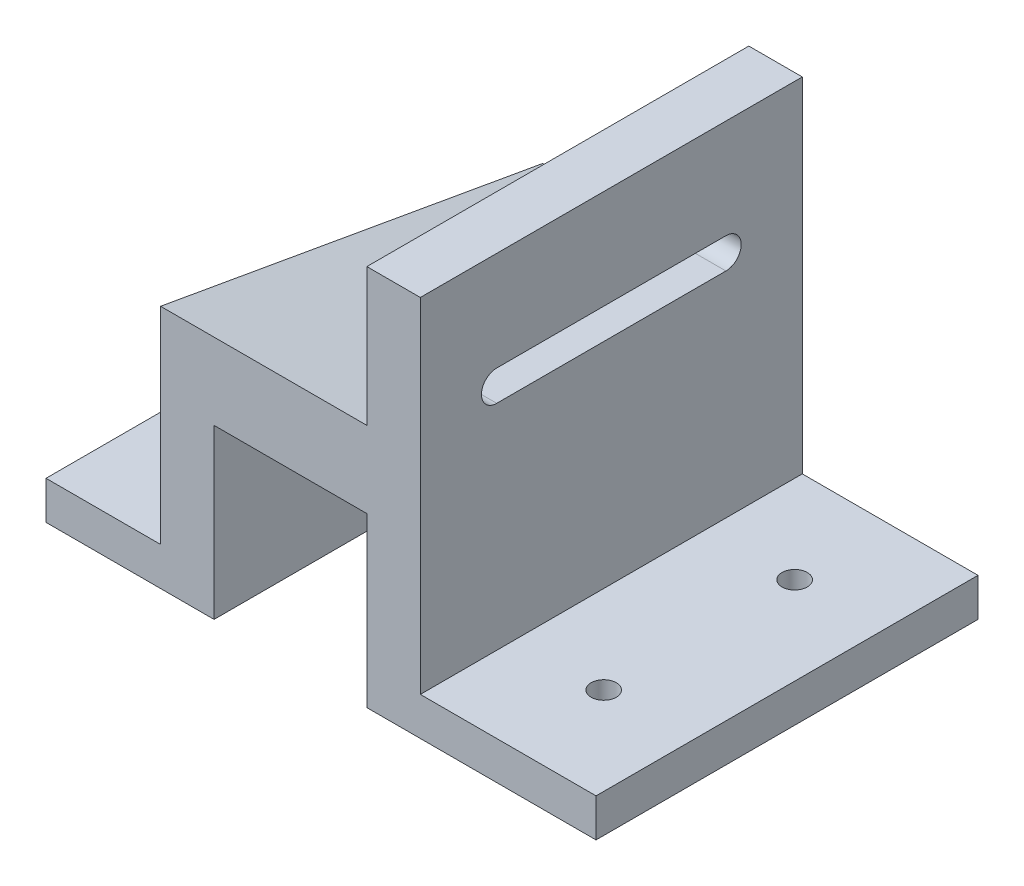
ISO-10303-21;
HEADER;
FILE_DESCRIPTION(('STEP AP214'),'2;1');
FILE_NAME('part.step','',(''),(''),'','','');
FILE_SCHEMA(('AUTOMOTIVE_DESIGN { 1 0 10303 214 1 1 1 1 }'));
ENDSEC;
DATA;
#1=APPLICATION_CONTEXT('core data for automotive mechanical design processes');
#2=APPLICATION_PROTOCOL_DEFINITION('international standard','automotive_design',2000,#1);
#3=PRODUCT_CONTEXT('',#1,'mechanical');
#4=PRODUCT('Part','Part','',(#3));
#5=PRODUCT_RELATED_PRODUCT_CATEGORY('part','',(#4));
#6=PRODUCT_DEFINITION_FORMATION('','',#4);
#7=PRODUCT_DEFINITION_CONTEXT('part definition',#1,'design');
#8=PRODUCT_DEFINITION('design','',#6,#7);
#9=PRODUCT_DEFINITION_SHAPE('','',#8);
#10=(LENGTH_UNIT() NAMED_UNIT(*) SI_UNIT(.MILLI.,.METRE.));
#11=(NAMED_UNIT(*) PLANE_ANGLE_UNIT() SI_UNIT($,.RADIAN.));
#12=(NAMED_UNIT(*) SI_UNIT($,.STERADIAN.) SOLID_ANGLE_UNIT());
#13=UNCERTAINTY_MEASURE_WITH_UNIT(LENGTH_MEASURE(1.E-05),#10,'distance_accuracy_value','');
#14=(GEOMETRIC_REPRESENTATION_CONTEXT(3) GLOBAL_UNCERTAINTY_ASSIGNED_CONTEXT((#13)) GLOBAL_UNIT_ASSIGNED_CONTEXT((#10,
#11,#12)) REPRESENTATION_CONTEXT('',''));
#15=CARTESIAN_POINT('',(0.,0.,0.));
#16=DIRECTION('',(0.,0.,1.));
#17=DIRECTION('',(1.,0.,0.));
#18=AXIS2_PLACEMENT_3D('',#15,#16,#17);
#19=CARTESIAN_POINT('',(0.,7.,50.));
#20=DIRECTION('',(1.,0.,0.));
#21=DIRECTION('',(0.,0.,-1.));
#22=AXIS2_PLACEMENT_3D('',#19,#20,#21);
#23=PLANE('',#22);
#24=DIRECTION('',(0.,-1.,0.));
#25=VECTOR('',#24,1.);
#26=CARTESIAN_POINT('',(0.,7.,50.));
#27=LINE('',#26,#25);
#28=CARTESIAN_POINT('',(0.,22.,50.));
#29=VERTEX_POINT('',#28);
#30=CARTESIAN_POINT('',(0.,0.,50.));
#31=VERTEX_POINT('',#30);
#32=EDGE_CURVE('E160',#29,#31,#27,.T.);
#33=ORIENTED_EDGE('',*,*,#32,.F.);
#34=DIRECTION('',(0.,0.173648177666935,0.984807753012207));
#35=VECTOR('',#34,1.);
#36=CARTESIAN_POINT('',(0.,12.201530393167,-5.56988254130722));
#37=LINE('',#36,#35);
#38=CARTESIAN_POINT('',(0.,13.1836509645765,0.));
#39=VERTEX_POINT('',#38);
#40=EDGE_CURVE('E162',#39,#29,#37,.T.);
#41=ORIENTED_EDGE('',*,*,#40,.F.);
#42=DIRECTION('',(0.,-1.,0.));
#43=VECTOR('',#42,1.);
#44=CARTESIAN_POINT('',(0.,7.,0.));
#45=LINE('',#44,#43);
#46=CARTESIAN_POINT('',(0.,0.,0.));
#47=VERTEX_POINT('',#46);
#48=EDGE_CURVE('E46',#39,#47,#45,.T.);
#49=ORIENTED_EDGE('',*,*,#48,.T.);
#50=DIRECTION('',(0.,0.,-1.));
#51=VECTOR('',#50,1.);
#52=CARTESIAN_POINT('',(0.,0.,50.));
#53=LINE('',#52,#51);
#54=EDGE_CURVE('E164',#31,#47,#53,.T.);
#55=ORIENTED_EDGE('',*,*,#54,.F.);
#56=EDGE_LOOP('',(#33,#41,#49,#55));
#57=FACE_BOUND('',#56,.T.);
#58=ADVANCED_FACE('F33',(#57),#23,.F.);
#59=CARTESIAN_POINT('',(0.,0.,50.));
#60=DIRECTION('',(0.,1.,0.));
#61=DIRECTION('',(0.,0.,1.));
#62=AXIS2_PLACEMENT_3D('',#59,#60,#61);
#63=PLANE('',#62);
#64=CARTESIAN_POINT('',(18.5,0.,12.5));
#65=DIRECTION('',(0.,1.,0.));
#66=DIRECTION('',(0.,0.,1.));
#67=AXIS2_PLACEMENT_3D('',#64,#65,#66);
#68=CIRCLE('',#67,1.65);
#69=CARTESIAN_POINT('',(18.5,0.,14.15));
#70=VERTEX_POINT('',#69);
#71=EDGE_CURVE('E203',#70,#70,#68,.T.);
#72=ORIENTED_EDGE('',*,*,#71,.T.);
#73=EDGE_LOOP('',(#72));
#74=FACE_BOUND('',#73,.T.);
#75=CARTESIAN_POINT('',(18.5,0.,37.5));
#76=DIRECTION('',(0.,1.,0.));
#77=DIRECTION('',(0.,0.,1.));
#78=AXIS2_PLACEMENT_3D('',#75,#76,#77);
#79=CIRCLE('',#78,1.65);
#80=CARTESIAN_POINT('',(18.5,0.,39.15));
#81=VERTEX_POINT('',#80);
#82=EDGE_CURVE('E210',#81,#81,#79,.T.);
#83=ORIENTED_EDGE('',*,*,#82,.T.);
#84=EDGE_LOOP('',(#83));
#85=FACE_BOUND('',#84,.T.);
#86=DIRECTION('',(1.,0.,0.));
#87=VECTOR('',#86,1.);
#88=CARTESIAN_POINT('',(0.,0.,0.));
#89=LINE('',#88,#87);
#90=CARTESIAN_POINT('',(30.,0.,0.));
#91=VERTEX_POINT('',#90);
#92=EDGE_CURVE('E258',#47,#91,#89,.T.);
#93=ORIENTED_EDGE('',*,*,#92,.T.);
#94=DIRECTION('',(0.,0.,-1.));
#95=VECTOR('',#94,1.);
#96=CARTESIAN_POINT('',(30.,0.,50.));
#97=LINE('',#96,#95);
#98=CARTESIAN_POINT('',(30.,0.,50.));
#99=VERTEX_POINT('',#98);
#100=EDGE_CURVE('E300',#99,#91,#97,.T.);
#101=ORIENTED_EDGE('',*,*,#100,.F.);
#102=DIRECTION('',(1.,0.,0.));
#103=VECTOR('',#102,1.);
#104=CARTESIAN_POINT('',(0.,0.,50.));
#105=LINE('',#104,#103);
#106=EDGE_CURVE('E167',#31,#99,#105,.T.);
#107=ORIENTED_EDGE('',*,*,#106,.F.);
#108=ORIENTED_EDGE('',*,*,#54,.T.);
#109=EDGE_LOOP('',(#93,#101,#107,#108));
#110=FACE_BOUND('',#109,.T.);
#111=ADVANCED_FACE('F351',(#74,#85,#110),#63,.F.);
#112=CARTESIAN_POINT('',(30.,0.,50.));
#113=DIRECTION('',(-1.,0.,0.));
#114=DIRECTION('',(0.,0.,1.));
#115=AXIS2_PLACEMENT_3D('',#112,#113,#114);
#116=PLANE('',#115);
#117=DIRECTION('',(0.,1.,0.));
#118=VECTOR('',#117,1.);
#119=CARTESIAN_POINT('',(30.,0.,0.));
#120=LINE('',#119,#118);
#121=CARTESIAN_POINT('',(30.,5.,0.));
#122=VERTEX_POINT('',#121);
#123=EDGE_CURVE('E260',#91,#122,#120,.T.);
#124=ORIENTED_EDGE('',*,*,#123,.T.);
#125=DIRECTION('',(0.,0.,-1.));
#126=VECTOR('',#125,1.);
#127=CARTESIAN_POINT('',(30.,5.,50.));
#128=LINE('',#127,#126);
#129=CARTESIAN_POINT('',(30.,5.,50.));
#130=VERTEX_POINT('',#129);
#131=EDGE_CURVE('E297',#130,#122,#128,.T.);
#132=ORIENTED_EDGE('',*,*,#131,.F.);
#133=DIRECTION('',(0.,1.,0.));
#134=VECTOR('',#133,1.);
#135=CARTESIAN_POINT('',(30.,0.,50.));
#136=LINE('',#135,#134);
#137=EDGE_CURVE('E234',#99,#130,#136,.T.);
#138=ORIENTED_EDGE('',*,*,#137,.F.);
#139=ORIENTED_EDGE('',*,*,#100,.T.);
#140=EDGE_LOOP('',(#124,#132,#138,#139));
#141=FACE_BOUND('',#140,.T.);
#142=ADVANCED_FACE('F355',(#141),#116,.F.);
#143=CARTESIAN_POINT('',(30.,5.,50.));
#144=DIRECTION('',(0.,-1.,0.));
#145=DIRECTION('',(1.,0.,0.));
#146=AXIS2_PLACEMENT_3D('',#143,#144,#145);
#147=PLANE('',#146);
#148=CARTESIAN_POINT('',(18.5,5.,12.5));
#149=DIRECTION('',(0.,1.,0.));
#150=DIRECTION('',(-1.,0.,0.));
#151=AXIS2_PLACEMENT_3D('',#148,#149,#150);
#152=CIRCLE('',#151,1.65);
#153=CARTESIAN_POINT('',(16.85,5.,12.5));
#154=VERTEX_POINT('',#153);
#155=EDGE_CURVE('E194',#154,#154,#152,.T.);
#156=ORIENTED_EDGE('',*,*,#155,.F.);
#157=EDGE_LOOP('',(#156));
#158=FACE_BOUND('',#157,.T.);
#159=CARTESIAN_POINT('',(18.5,5.,37.5));
#160=DIRECTION('',(0.,1.,0.));
#161=DIRECTION('',(-1.,0.,0.));
#162=AXIS2_PLACEMENT_3D('',#159,#160,#161);
#163=CIRCLE('',#162,1.65);
#164=CARTESIAN_POINT('',(16.85,5.,37.5));
#165=VERTEX_POINT('',#164);
#166=EDGE_CURVE('E206',#165,#165,#163,.T.);
#167=ORIENTED_EDGE('',*,*,#166,.F.);
#168=EDGE_LOOP('',(#167));
#169=FACE_BOUND('',#168,.T.);
#170=DIRECTION('',(-1.,0.,0.));
#171=VECTOR('',#170,1.);
#172=CARTESIAN_POINT('',(30.,5.,0.));
#173=LINE('',#172,#171);
#174=CARTESIAN_POINT('',(7.,5.,0.));
#175=VERTEX_POINT('',#174);
#176=EDGE_CURVE('E262',#122,#175,#173,.T.);
#177=ORIENTED_EDGE('',*,*,#176,.T.);
#178=DIRECTION('',(0.,0.,-1.));
#179=VECTOR('',#178,1.);
#180=CARTESIAN_POINT('',(7.,5.,50.));
#181=LINE('',#180,#179);
#182=CARTESIAN_POINT('',(7.,5.,50.));
#183=VERTEX_POINT('',#182);
#184=EDGE_CURVE('E294',#183,#175,#181,.T.);
#185=ORIENTED_EDGE('',*,*,#184,.F.);
#186=DIRECTION('',(-1.,0.,0.));
#187=VECTOR('',#186,1.);
#188=CARTESIAN_POINT('',(30.,5.,50.));
#189=LINE('',#188,#187);
#190=EDGE_CURVE('E236',#130,#183,#189,.T.);
#191=ORIENTED_EDGE('',*,*,#190,.F.);
#192=ORIENTED_EDGE('',*,*,#131,.T.);
#193=EDGE_LOOP('',(#177,#185,#191,#192));
#194=FACE_BOUND('',#193,.T.);
#195=ADVANCED_FACE('F360',(#158,#169,#194),#147,.F.);
#196=CARTESIAN_POINT('',(7.,5.,50.));
#197=DIRECTION('',(-1.,0.,0.));
#198=DIRECTION('',(0.,-1.,0.));
#199=AXIS2_PLACEMENT_3D('',#196,#197,#198);
#200=PLANE('',#199);
#201=CARTESIAN_POINT('',(7.,35.,10.));
#202=DIRECTION('',(1.,0.,0.));
#203=DIRECTION('',(0.,1.,0.));
#204=AXIS2_PLACEMENT_3D('',#201,#202,#203);
#205=CIRCLE('',#204,2.00000000000002);
#206=CARTESIAN_POINT('',(7.,33.,10.));
#207=VERTEX_POINT('',#206);
#208=CARTESIAN_POINT('',(7.,37.,10.));
#209=VERTEX_POINT('',#208);
#210=EDGE_CURVE('E215',#207,#209,#205,.T.);
#211=ORIENTED_EDGE('',*,*,#210,.F.);
#212=DIRECTION('',(0.,0.,-1.));
#213=VECTOR('',#212,1.);
#214=CARTESIAN_POINT('',(7.,33.,0.));
#215=LINE('',#214,#213);
#216=CARTESIAN_POINT('',(7.,33.,40.));
#217=VERTEX_POINT('',#216);
#218=EDGE_CURVE('E213',#217,#207,#215,.T.);
#219=ORIENTED_EDGE('',*,*,#218,.F.);
#220=CARTESIAN_POINT('',(7.,35.,40.));
#221=DIRECTION('',(1.,0.,0.));
#222=DIRECTION('',(0.,1.,0.));
#223=AXIS2_PLACEMENT_3D('',#220,#221,#222);
#224=CIRCLE('',#223,2.00000000000002);
#225=CARTESIAN_POINT('',(7.,37.,40.));
#226=VERTEX_POINT('',#225);
#227=EDGE_CURVE('E221',#226,#217,#224,.T.);
#228=ORIENTED_EDGE('',*,*,#227,.F.);
#229=DIRECTION('',(0.,0.,-1.));
#230=VECTOR('',#229,1.);
#231=CARTESIAN_POINT('',(7.,37.,0.));
#232=LINE('',#231,#230);
#233=EDGE_CURVE('E218',#226,#209,#232,.T.);
#234=ORIENTED_EDGE('',*,*,#233,.T.);
#235=EDGE_LOOP('',(#211,#219,#228,#234));
#236=FACE_BOUND('',#235,.T.);
#237=DIRECTION('',(0.,1.,0.));
#238=VECTOR('',#237,1.);
#239=CARTESIAN_POINT('',(7.,5.,0.));
#240=LINE('',#239,#238);
#241=CARTESIAN_POINT('',(7.,50.,0.));
#242=VERTEX_POINT('',#241);
#243=EDGE_CURVE('E264',#175,#242,#240,.T.);
#244=ORIENTED_EDGE('',*,*,#243,.T.);
#245=DIRECTION('',(0.,0.,-1.));
#246=VECTOR('',#245,1.);
#247=CARTESIAN_POINT('',(7.,50.,50.));
#248=LINE('',#247,#246);
#249=CARTESIAN_POINT('',(7.,50.,50.));
#250=VERTEX_POINT('',#249);
#251=EDGE_CURVE('E291',#250,#242,#248,.T.);
#252=ORIENTED_EDGE('',*,*,#251,.F.);
#253=DIRECTION('',(0.,1.,0.));
#254=VECTOR('',#253,1.);
#255=CARTESIAN_POINT('',(7.,5.,50.));
#256=LINE('',#255,#254);
#257=EDGE_CURVE('E238',#183,#250,#256,.T.);
#258=ORIENTED_EDGE('',*,*,#257,.F.);
#259=ORIENTED_EDGE('',*,*,#184,.T.);
#260=EDGE_LOOP('',(#244,#252,#258,#259));
#261=FACE_BOUND('',#260,.T.);
#262=ADVANCED_FACE('F347',(#236,#261),#200,.F.);
#263=CARTESIAN_POINT('',(7.,50.,50.));
#264=DIRECTION('',(0.,-1.,0.));
#265=DIRECTION('',(0.,0.,-1.));
#266=AXIS2_PLACEMENT_3D('',#263,#264,#265);
#267=PLANE('',#266);
#268=DIRECTION('',(-1.,0.,0.));
#269=VECTOR('',#268,1.);
#270=CARTESIAN_POINT('',(7.,50.,0.));
#271=LINE('',#270,#269);
#272=CARTESIAN_POINT('',(0.,50.,0.));
#273=VERTEX_POINT('',#272);
#274=EDGE_CURVE('E266',#242,#273,#271,.T.);
#275=ORIENTED_EDGE('',*,*,#274,.T.);
#276=DIRECTION('',(0.,0.,-1.));
#277=VECTOR('',#276,1.);
#278=CARTESIAN_POINT('',(0.,50.,50.));
#279=LINE('',#278,#277);
#280=CARTESIAN_POINT('',(0.,50.,50.));
#281=VERTEX_POINT('',#280);
#282=EDGE_CURVE('E289',#281,#273,#279,.T.);
#283=ORIENTED_EDGE('',*,*,#282,.F.);
#284=DIRECTION('',(-1.,0.,0.));
#285=VECTOR('',#284,1.);
#286=CARTESIAN_POINT('',(7.,50.,50.));
#287=LINE('',#286,#285);
#288=EDGE_CURVE('E240',#250,#281,#287,.T.);
#289=ORIENTED_EDGE('',*,*,#288,.F.);
#290=ORIENTED_EDGE('',*,*,#251,.T.);
#291=EDGE_LOOP('',(#275,#283,#289,#290));
#292=FACE_BOUND('',#291,.T.);
#293=ADVANCED_FACE('F338',(#292),#267,.F.);
#294=CARTESIAN_POINT('',(0.,50.,50.));
#295=DIRECTION('',(1.,0.,0.));
#296=DIRECTION('',(0.,1.,0.));
#297=AXIS2_PLACEMENT_3D('',#294,#295,#296);
#298=PLANE('',#297);
#299=CARTESIAN_POINT('',(0.,35.,10.));
#300=DIRECTION('',(1.,0.,0.));
#301=DIRECTION('',(0.,1.,0.));
#302=AXIS2_PLACEMENT_3D('',#299,#300,#301);
#303=CIRCLE('',#302,2.00000000000002);
#304=CARTESIAN_POINT('',(0.,33.,10.));
#305=VERTEX_POINT('',#304);
#306=CARTESIAN_POINT('',(0.,37.,10.));
#307=VERTEX_POINT('',#306);
#308=EDGE_CURVE('E304',#305,#307,#303,.T.);
#309=ORIENTED_EDGE('',*,*,#308,.T.);
#310=DIRECTION('',(0.,0.,-1.));
#311=VECTOR('',#310,1.);
#312=CARTESIAN_POINT('',(0.,37.,50.));
#313=LINE('',#312,#311);
#314=CARTESIAN_POINT('',(0.,37.,40.));
#315=VERTEX_POINT('',#314);
#316=EDGE_CURVE('E307',#315,#307,#313,.T.);
#317=ORIENTED_EDGE('',*,*,#316,.F.);
#318=CARTESIAN_POINT('',(0.,35.,40.));
#319=DIRECTION('',(1.,0.,0.));
#320=DIRECTION('',(0.,1.,0.));
#321=AXIS2_PLACEMENT_3D('',#318,#319,#320);
#322=CIRCLE('',#321,2.00000000000002);
#323=CARTESIAN_POINT('',(0.,33.,40.));
#324=VERTEX_POINT('',#323);
#325=EDGE_CURVE('E309',#315,#324,#322,.T.);
#326=ORIENTED_EDGE('',*,*,#325,.T.);
#327=DIRECTION('',(0.,0.,-1.));
#328=VECTOR('',#327,1.);
#329=CARTESIAN_POINT('',(0.,33.,50.));
#330=LINE('',#329,#328);
#331=EDGE_CURVE('E312',#324,#305,#330,.T.);
#332=ORIENTED_EDGE('',*,*,#331,.T.);
#333=EDGE_LOOP('',(#309,#317,#326,#332));
#334=FACE_BOUND('',#333,.T.);
#335=DIRECTION('',(0.,-1.,0.));
#336=VECTOR('',#335,1.);
#337=CARTESIAN_POINT('',(0.,50.,0.));
#338=LINE('',#337,#336);
#339=CARTESIAN_POINT('',(0.,23.1836509645765,0.));
#340=VERTEX_POINT('',#339);
#341=EDGE_CURVE('E54',#273,#340,#338,.T.);
#342=ORIENTED_EDGE('',*,*,#341,.T.);
#343=DIRECTION('',(0.,0.173648177666935,0.984807753012207));
#344=VECTOR('',#343,1.);
#345=CARTESIAN_POINT('',(0.,22.201530393167,-5.56988254130722));
#346=LINE('',#345,#344);
#347=CARTESIAN_POINT('',(0.,32.,50.));
#348=VERTEX_POINT('',#347);
#349=EDGE_CURVE('E190',#340,#348,#346,.T.);
#350=ORIENTED_EDGE('',*,*,#349,.T.);
#351=DIRECTION('',(0.,-1.,0.));
#352=VECTOR('',#351,1.);
#353=CARTESIAN_POINT('',(0.,50.,50.));
#354=LINE('',#353,#352);
#355=EDGE_CURVE('E242',#281,#348,#354,.T.);
#356=ORIENTED_EDGE('',*,*,#355,.F.);
#357=ORIENTED_EDGE('',*,*,#282,.T.);
#358=EDGE_LOOP('',(#342,#350,#356,#357));
#359=FACE_BOUND('',#358,.T.);
#360=ADVANCED_FACE('F336',(#334,#359),#298,.F.);
#361=CARTESIAN_POINT('',(-27.,4.99999999999999,50.));
#362=DIRECTION('',(1.,0.,0.));
#363=DIRECTION('',(0.,0.,-1.));
#364=AXIS2_PLACEMENT_3D('',#361,#362,#363);
#365=PLANE('',#364);
#366=DIRECTION('',(0.,-1.,0.));
#367=VECTOR('',#366,1.);
#368=CARTESIAN_POINT('',(-27.,4.99999999999999,50.));
#369=LINE('',#368,#367);
#370=CARTESIAN_POINT('',(-27.,32.,50.));
#371=VERTEX_POINT('',#370);
#372=CARTESIAN_POINT('',(-27.,4.99999999999999,50.));
#373=VERTEX_POINT('',#372);
#374=EDGE_CURVE('E247',#371,#373,#369,.T.);
#375=ORIENTED_EDGE('',*,*,#374,.F.);
#376=DIRECTION('',(0.,0.173648177666935,0.984807753012207));
#377=VECTOR('',#376,1.);
#378=CARTESIAN_POINT('',(-27.,22.201530393167,-5.56988254130722));
#379=LINE('',#378,#377);
#380=CARTESIAN_POINT('',(-27.,23.1836509645765,0.));
#381=VERTEX_POINT('',#380);
#382=EDGE_CURVE('E188',#381,#371,#379,.T.);
#383=ORIENTED_EDGE('',*,*,#382,.F.);
#384=DIRECTION('',(0.,-1.,0.));
#385=VECTOR('',#384,1.);
#386=CARTESIAN_POINT('',(-27.,4.99999999999999,0.));
#387=LINE('',#386,#385);
#388=CARTESIAN_POINT('',(-27.,4.99999999999999,0.));
#389=VERTEX_POINT('',#388);
#390=EDGE_CURVE('E269',#381,#389,#387,.T.);
#391=ORIENTED_EDGE('',*,*,#390,.T.);
#392=DIRECTION('',(0.,0.,-1.));
#393=VECTOR('',#392,1.);
#394=CARTESIAN_POINT('',(-27.,4.99999999999999,50.));
#395=LINE('',#394,#393);
#396=EDGE_CURVE('E286',#373,#389,#395,.T.);
#397=ORIENTED_EDGE('',*,*,#396,.F.);
#398=EDGE_LOOP('',(#375,#383,#391,#397));
#399=FACE_BOUND('',#398,.T.);
#400=ADVANCED_FACE('F329',(#399),#365,.F.);
#401=CARTESIAN_POINT('',(-42.,4.99999999999999,50.));
#402=DIRECTION('',(0.,-1.,0.));
#403=DIRECTION('',(0.,0.,-1.));
#404=AXIS2_PLACEMENT_3D('',#401,#402,#403);
#405=PLANE('',#404);
#406=CARTESIAN_POINT('',(-34.5,4.99999999999999,12.5));
#407=DIRECTION('',(0.,1.,0.));
#408=DIRECTION('',(1.,0.,0.));
#409=AXIS2_PLACEMENT_3D('',#406,#407,#408);
#410=CIRCLE('',#409,1.65);
#411=CARTESIAN_POINT('',(-32.85,4.99999999999999,12.5));
#412=VERTEX_POINT('',#411);
#413=EDGE_CURVE('E198',#412,#412,#410,.T.);
#414=ORIENTED_EDGE('',*,*,#413,.F.);
#415=EDGE_LOOP('',(#414));
#416=FACE_BOUND('',#415,.T.);
#417=CARTESIAN_POINT('',(-34.5,4.99999999999999,37.5));
#418=DIRECTION('',(0.,1.,0.));
#419=DIRECTION('',(1.,0.,0.));
#420=AXIS2_PLACEMENT_3D('',#417,#418,#419);
#421=CIRCLE('',#420,1.65);
#422=CARTESIAN_POINT('',(-32.85,4.99999999999999,37.5));
#423=VERTEX_POINT('',#422);
#424=EDGE_CURVE('E192',#423,#423,#421,.T.);
#425=ORIENTED_EDGE('',*,*,#424,.F.);
#426=EDGE_LOOP('',(#425));
#427=FACE_BOUND('',#426,.T.);
#428=DIRECTION('',(-1.,0.,0.));
#429=VECTOR('',#428,1.);
#430=CARTESIAN_POINT('',(-42.,4.99999999999999,0.));
#431=LINE('',#430,#429);
#432=CARTESIAN_POINT('',(-42.,4.99999999999999,0.));
#433=VERTEX_POINT('',#432);
#434=EDGE_CURVE('E271',#389,#433,#431,.T.);
#435=ORIENTED_EDGE('',*,*,#434,.T.);
#436=DIRECTION('',(0.,0.,-1.));
#437=VECTOR('',#436,1.);
#438=CARTESIAN_POINT('',(-42.,4.99999999999999,50.));
#439=LINE('',#438,#437);
#440=CARTESIAN_POINT('',(-42.,4.99999999999999,50.));
#441=VERTEX_POINT('',#440);
#442=EDGE_CURVE('E283',#441,#433,#439,.T.);
#443=ORIENTED_EDGE('',*,*,#442,.F.);
#444=DIRECTION('',(-1.,0.,0.));
#445=VECTOR('',#444,1.);
#446=CARTESIAN_POINT('',(-42.,4.99999999999999,50.));
#447=LINE('',#446,#445);
#448=EDGE_CURVE('E249',#373,#441,#447,.T.);
#449=ORIENTED_EDGE('',*,*,#448,.F.);
#450=ORIENTED_EDGE('',*,*,#396,.T.);
#451=EDGE_LOOP('',(#435,#443,#449,#450));
#452=FACE_BOUND('',#451,.T.);
#453=ADVANCED_FACE('F345',(#416,#427,#452),#405,.F.);
#454=CARTESIAN_POINT('',(-42.,0.,50.));
#455=DIRECTION('',(1.,0.,0.));
#456=DIRECTION('',(0.,0.,-1.));
#457=AXIS2_PLACEMENT_3D('',#454,#455,#456);
#458=PLANE('',#457);
#459=DIRECTION('',(0.,-1.,0.));
#460=VECTOR('',#459,1.);
#461=CARTESIAN_POINT('',(-42.,0.,0.));
#462=LINE('',#461,#460);
#463=CARTESIAN_POINT('',(-42.,0.,0.));
#464=VERTEX_POINT('',#463);
#465=EDGE_CURVE('E273',#433,#464,#462,.T.);
#466=ORIENTED_EDGE('',*,*,#465,.T.);
#467=DIRECTION('',(0.,0.,-1.));
#468=VECTOR('',#467,1.);
#469=CARTESIAN_POINT('',(-42.,0.,50.));
#470=LINE('',#469,#468);
#471=CARTESIAN_POINT('',(-42.,0.,50.));
#472=VERTEX_POINT('',#471);
#473=EDGE_CURVE('E280',#472,#464,#470,.T.);
#474=ORIENTED_EDGE('',*,*,#473,.F.);
#475=DIRECTION('',(0.,-1.,0.));
#476=VECTOR('',#475,1.);
#477=CARTESIAN_POINT('',(-42.,0.,50.));
#478=LINE('',#477,#476);
#479=EDGE_CURVE('E251',#441,#472,#478,.T.);
#480=ORIENTED_EDGE('',*,*,#479,.F.);
#481=ORIENTED_EDGE('',*,*,#442,.T.);
#482=EDGE_LOOP('',(#466,#474,#480,#481));
#483=FACE_BOUND('',#482,.T.);
#484=ADVANCED_FACE('F426',(#483),#458,.F.);
#485=CARTESIAN_POINT('',(-20.,0.,50.));
#486=DIRECTION('',(0.,1.,0.));
#487=DIRECTION('',(-1.,0.,0.));
#488=AXIS2_PLACEMENT_3D('',#485,#486,#487);
#489=PLANE('',#488);
#490=CARTESIAN_POINT('',(-34.5,0.,12.5));
#491=DIRECTION('',(0.,1.,0.));
#492=DIRECTION('',(-1.,0.,0.));
#493=AXIS2_PLACEMENT_3D('',#490,#491,#492);
#494=CIRCLE('',#493,1.65);
#495=CARTESIAN_POINT('',(-36.15,0.,12.5));
#496=VERTEX_POINT('',#495);
#497=EDGE_CURVE('E207',#496,#496,#494,.T.);
#498=ORIENTED_EDGE('',*,*,#497,.T.);
#499=EDGE_LOOP('',(#498));
#500=FACE_BOUND('',#499,.T.);
#501=CARTESIAN_POINT('',(-34.5,0.,37.5));
#502=DIRECTION('',(0.,1.,0.));
#503=DIRECTION('',(-1.,0.,0.));
#504=AXIS2_PLACEMENT_3D('',#501,#502,#503);
#505=CIRCLE('',#504,1.65);
#506=CARTESIAN_POINT('',(-36.15,0.,37.5));
#507=VERTEX_POINT('',#506);
#508=EDGE_CURVE('E197',#507,#507,#505,.T.);
#509=ORIENTED_EDGE('',*,*,#508,.T.);
#510=EDGE_LOOP('',(#509));
#511=FACE_BOUND('',#510,.T.);
#512=DIRECTION('',(1.,0.,0.));
#513=VECTOR('',#512,1.);
#514=CARTESIAN_POINT('',(-20.,0.,0.));
#515=LINE('',#514,#513);
#516=CARTESIAN_POINT('',(-20.,0.,0.));
#517=VERTEX_POINT('',#516);
#518=EDGE_CURVE('E275',#464,#517,#515,.T.);
#519=ORIENTED_EDGE('',*,*,#518,.T.);
#520=DIRECTION('',(0.,0.,-1.));
#521=VECTOR('',#520,1.);
#522=CARTESIAN_POINT('',(-20.,0.,50.));
#523=LINE('',#522,#521);
#524=CARTESIAN_POINT('',(-20.,0.,50.));
#525=VERTEX_POINT('',#524);
#526=EDGE_CURVE('E256',#525,#517,#523,.T.);
#527=ORIENTED_EDGE('',*,*,#526,.F.);
#528=DIRECTION('',(1.,0.,0.));
#529=VECTOR('',#528,1.);
#530=CARTESIAN_POINT('',(-20.,0.,50.));
#531=LINE('',#530,#529);
#532=EDGE_CURVE('E253',#472,#525,#531,.T.);
#533=ORIENTED_EDGE('',*,*,#532,.F.);
#534=ORIENTED_EDGE('',*,*,#473,.T.);
#535=EDGE_LOOP('',(#519,#527,#533,#534));
#536=FACE_BOUND('',#535,.T.);
#537=ADVANCED_FACE('F422',(#500,#511,#536),#489,.F.);
#538=CARTESIAN_POINT('',(-20.,0.,50.));
#539=DIRECTION('',(-1.,0.,0.));
#540=DIRECTION('',(0.,0.,1.));
#541=AXIS2_PLACEMENT_3D('',#538,#539,#540);
#542=PLANE('',#541);
#543=ORIENTED_EDGE('',*,*,#526,.T.);
#544=DIRECTION('',(0.,1.,0.));
#545=VECTOR('',#544,1.);
#546=CARTESIAN_POINT('',(-20.,0.,0.));
#547=LINE('',#546,#545);
#548=CARTESIAN_POINT('',(-20.,13.1836509645765,0.));
#549=VERTEX_POINT('',#548);
#550=EDGE_CURVE('E168',#517,#549,#547,.T.);
#551=ORIENTED_EDGE('',*,*,#550,.T.);
#552=DIRECTION('',(0.,0.173648177666935,0.984807753012207));
#553=VECTOR('',#552,1.);
#554=CARTESIAN_POINT('',(-20.,12.201530393167,-5.56988254130722));
#555=LINE('',#554,#553);
#556=CARTESIAN_POINT('',(-20.,22.,50.));
#557=VERTEX_POINT('',#556);
#558=EDGE_CURVE('E175',#549,#557,#555,.T.);
#559=ORIENTED_EDGE('',*,*,#558,.T.);
#560=DIRECTION('',(0.,1.,0.));
#561=VECTOR('',#560,1.);
#562=CARTESIAN_POINT('',(-20.,0.,50.));
#563=LINE('',#562,#561);
#564=EDGE_CURVE('E179',#525,#557,#563,.T.);
#565=ORIENTED_EDGE('',*,*,#564,.F.);
#566=EDGE_LOOP('',(#543,#551,#559,#565));
#567=FACE_BOUND('',#566,.T.);
#568=ADVANCED_FACE('F417',(#567),#542,.F.);
#569=CARTESIAN_POINT('',(0.,0.,50.));
#570=DIRECTION('',(0.,0.,1.));
#571=DIRECTION('',(1.,0.,0.));
#572=AXIS2_PLACEMENT_3D('',#569,#570,#571);
#573=PLANE('',#572);
#574=ORIENTED_EDGE('',*,*,#564,.T.);
#575=DIRECTION('',(-1.,0.,0.));
#576=VECTOR('',#575,1.);
#577=CARTESIAN_POINT('',(-20.,22.,50.));
#578=LINE('',#577,#576);
#579=EDGE_CURVE('E174',#29,#557,#578,.T.);
#580=ORIENTED_EDGE('',*,*,#579,.F.);
#581=ORIENTED_EDGE('',*,*,#32,.T.);
#582=ORIENTED_EDGE('',*,*,#106,.T.);
#583=ORIENTED_EDGE('',*,*,#137,.T.);
#584=ORIENTED_EDGE('',*,*,#190,.T.);
#585=ORIENTED_EDGE('',*,*,#257,.T.);
#586=ORIENTED_EDGE('',*,*,#288,.T.);
#587=ORIENTED_EDGE('',*,*,#355,.T.);
#588=DIRECTION('',(-1.,0.,0.));
#589=VECTOR('',#588,1.);
#590=CARTESIAN_POINT('',(-20.,32.,50.));
#591=LINE('',#590,#589);
#592=EDGE_CURVE('E244',#348,#371,#591,.T.);
#593=ORIENTED_EDGE('',*,*,#592,.T.);
#594=ORIENTED_EDGE('',*,*,#374,.T.);
#595=ORIENTED_EDGE('',*,*,#448,.T.);
#596=ORIENTED_EDGE('',*,*,#479,.T.);
#597=ORIENTED_EDGE('',*,*,#532,.T.);
#598=EDGE_LOOP('',(#574,#580,#581,#582,#583,#584,#585,#586,#587,#593,#594,#595,#596,#597));
#599=FACE_BOUND('',#598,.T.);
#600=ADVANCED_FACE('F177',(#599),#573,.T.);
#601=CARTESIAN_POINT('',(0.,0.,0.));
#602=DIRECTION('',(0.,0.,1.));
#603=DIRECTION('',(1.,0.,0.));
#604=AXIS2_PLACEMENT_3D('',#601,#602,#603);
#605=PLANE('',#604);
#606=DIRECTION('',(-1.,0.,0.));
#607=VECTOR('',#606,1.);
#608=CARTESIAN_POINT('',(0.,13.1836509645765,0.));
#609=LINE('',#608,#607);
#610=EDGE_CURVE('E11',#39,#549,#609,.T.);
#611=ORIENTED_EDGE('',*,*,#610,.T.);
#612=ORIENTED_EDGE('',*,*,#550,.F.);
#613=ORIENTED_EDGE('',*,*,#518,.F.);
#614=ORIENTED_EDGE('',*,*,#465,.F.);
#615=ORIENTED_EDGE('',*,*,#434,.F.);
#616=ORIENTED_EDGE('',*,*,#390,.F.);
#617=DIRECTION('',(1.,0.,0.));
#618=VECTOR('',#617,1.);
#619=CARTESIAN_POINT('',(0.,23.1836509645765,0.));
#620=LINE('',#619,#618);
#621=EDGE_CURVE('E40',#381,#340,#620,.T.);
#622=ORIENTED_EDGE('',*,*,#621,.T.);
#623=ORIENTED_EDGE('',*,*,#341,.F.);
#624=ORIENTED_EDGE('',*,*,#274,.F.);
#625=ORIENTED_EDGE('',*,*,#243,.F.);
#626=ORIENTED_EDGE('',*,*,#176,.F.);
#627=ORIENTED_EDGE('',*,*,#123,.F.);
#628=ORIENTED_EDGE('',*,*,#92,.F.);
#629=ORIENTED_EDGE('',*,*,#48,.F.);
#630=EDGE_LOOP('',(#611,#612,#613,#614,#615,#616,#622,#623,#624,#625,#626,#627,#628,#629));
#631=FACE_BOUND('',#630,.T.);
#632=ADVANCED_FACE('F320',(#631),#605,.F.);
#633=CARTESIAN_POINT('',(-43.,33.,0.));
#634=DIRECTION('',(0.,-1.,0.));
#635=DIRECTION('',(0.,0.,-1.));
#636=AXIS2_PLACEMENT_3D('',#633,#634,#635);
#637=PLANE('',#636);
#638=DIRECTION('',(1.,0.,0.));
#639=VECTOR('',#638,1.);
#640=CARTESIAN_POINT('',(-43.,33.,40.));
#641=LINE('',#640,#639);
#642=EDGE_CURVE('E225',#324,#217,#641,.T.);
#643=ORIENTED_EDGE('',*,*,#642,.T.);
#644=ORIENTED_EDGE('',*,*,#218,.T.);
#645=DIRECTION('',(1.,0.,0.));
#646=VECTOR('',#645,1.);
#647=CARTESIAN_POINT('',(-43.,33.,10.));
#648=LINE('',#647,#646);
#649=EDGE_CURVE('E224',#305,#207,#648,.T.);
#650=ORIENTED_EDGE('',*,*,#649,.F.);
#651=ORIENTED_EDGE('',*,*,#331,.F.);
#652=EDGE_LOOP('',(#643,#644,#650,#651));
#653=FACE_BOUND('',#652,.T.);
#654=ADVANCED_FACE('F394',(#653),#637,.F.);
#655=CARTESIAN_POINT('',(-43.,35.,40.));
#656=DIRECTION('',(1.,0.,0.));
#657=DIRECTION('',(0.,1.,0.));
#658=AXIS2_PLACEMENT_3D('',#655,#656,#657);
#659=CYLINDRICAL_SURFACE('',#658,2.00000000000002);
#660=DIRECTION('',(1.,0.,0.));
#661=VECTOR('',#660,1.);
#662=CARTESIAN_POINT('',(-43.,37.,40.));
#663=LINE('',#662,#661);
#664=EDGE_CURVE('E227',#315,#226,#663,.T.);
#665=ORIENTED_EDGE('',*,*,#664,.T.);
#666=ORIENTED_EDGE('',*,*,#227,.T.);
#667=ORIENTED_EDGE('',*,*,#642,.F.);
#668=ORIENTED_EDGE('',*,*,#325,.F.);
#669=EDGE_LOOP('',(#665,#666,#667,#668));
#670=FACE_BOUND('',#669,.T.);
#671=ADVANCED_FACE('F399',(#670),#659,.F.);
#672=CARTESIAN_POINT('',(-43.,37.,0.));
#673=DIRECTION('',(0.,-1.,0.));
#674=DIRECTION('',(0.,0.,-1.));
#675=AXIS2_PLACEMENT_3D('',#672,#673,#674);
#676=PLANE('',#675);
#677=ORIENTED_EDGE('',*,*,#316,.T.);
#678=DIRECTION('',(1.,0.,0.));
#679=VECTOR('',#678,1.);
#680=CARTESIAN_POINT('',(-43.,37.,10.));
#681=LINE('',#680,#679);
#682=EDGE_CURVE('E229',#307,#209,#681,.T.);
#683=ORIENTED_EDGE('',*,*,#682,.T.);
#684=ORIENTED_EDGE('',*,*,#233,.F.);
#685=ORIENTED_EDGE('',*,*,#664,.F.);
#686=EDGE_LOOP('',(#677,#683,#684,#685));
#687=FACE_BOUND('',#686,.T.);
#688=ADVANCED_FACE('F401',(#687),#676,.T.);
#689=CARTESIAN_POINT('',(-43.,35.,10.));
#690=DIRECTION('',(1.,0.,0.));
#691=DIRECTION('',(0.,1.,0.));
#692=AXIS2_PLACEMENT_3D('',#689,#690,#691);
#693=CYLINDRICAL_SURFACE('',#692,2.00000000000002);
#694=ORIENTED_EDGE('',*,*,#649,.T.);
#695=ORIENTED_EDGE('',*,*,#210,.T.);
#696=ORIENTED_EDGE('',*,*,#682,.F.);
#697=ORIENTED_EDGE('',*,*,#308,.F.);
#698=EDGE_LOOP('',(#694,#695,#696,#697));
#699=FACE_BOUND('',#698,.T.);
#700=ADVANCED_FACE('F391',(#699),#693,.F.);
#701=CARTESIAN_POINT('',(18.5,-5.,37.5));
#702=DIRECTION('',(0.,1.,0.));
#703=DIRECTION('',(-1.,0.,0.));
#704=AXIS2_PLACEMENT_3D('',#701,#702,#703);
#705=CYLINDRICAL_SURFACE('',#704,1.65);
#706=ORIENTED_EDGE('',*,*,#166,.T.);
#707=EDGE_LOOP('',(#706));
#708=FACE_BOUND('',#707,.T.);
#709=ORIENTED_EDGE('',*,*,#82,.F.);
#710=EDGE_LOOP('',(#709));
#711=FACE_BOUND('',#710,.T.);
#712=ADVANCED_FACE('F408',(#708,#711),#705,.F.);
#713=CARTESIAN_POINT('',(-34.5,-5.00000000000001,37.5));
#714=DIRECTION('',(0.,1.,0.));
#715=DIRECTION('',(-1.,0.,0.));
#716=AXIS2_PLACEMENT_3D('',#713,#714,#715);
#717=CYLINDRICAL_SURFACE('',#716,1.65);
#718=ORIENTED_EDGE('',*,*,#424,.T.);
#719=EDGE_LOOP('',(#718));
#720=FACE_BOUND('',#719,.T.);
#721=ORIENTED_EDGE('',*,*,#508,.F.);
#722=EDGE_LOOP('',(#721));
#723=FACE_BOUND('',#722,.T.);
#724=ADVANCED_FACE('F448',(#720,#723),#717,.F.);
#725=CARTESIAN_POINT('',(-34.5,-5.00000000000001,12.5));
#726=DIRECTION('',(0.,1.,0.));
#727=DIRECTION('',(-1.,0.,0.));
#728=AXIS2_PLACEMENT_3D('',#725,#726,#727);
#729=CYLINDRICAL_SURFACE('',#728,1.65);
#730=ORIENTED_EDGE('',*,*,#413,.T.);
#731=EDGE_LOOP('',(#730));
#732=FACE_BOUND('',#731,.T.);
#733=ORIENTED_EDGE('',*,*,#497,.F.);
#734=EDGE_LOOP('',(#733));
#735=FACE_BOUND('',#734,.T.);
#736=ADVANCED_FACE('F451',(#732,#735),#729,.F.);
#737=CARTESIAN_POINT('',(18.5,-5.,12.5));
#738=DIRECTION('',(0.,1.,0.));
#739=DIRECTION('',(-1.,0.,0.));
#740=AXIS2_PLACEMENT_3D('',#737,#738,#739);
#741=CYLINDRICAL_SURFACE('',#740,1.65);
#742=ORIENTED_EDGE('',*,*,#155,.T.);
#743=EDGE_LOOP('',(#742));
#744=FACE_BOUND('',#743,.T.);
#745=ORIENTED_EDGE('',*,*,#71,.F.);
#746=EDGE_LOOP('',(#745));
#747=FACE_BOUND('',#746,.T.);
#748=ADVANCED_FACE('F459',(#744,#747),#741,.F.);
#749=CARTESIAN_POINT('',(0.,22.201530393167,-5.56988254130722));
#750=DIRECTION('',(0.,-0.984807753012207,0.173648177666935));
#751=DIRECTION('',(0.,-0.173648177666935,-0.984807753012207));
#752=AXIS2_PLACEMENT_3D('',#749,#750,#751);
#753=PLANE('',#752);
#754=CARTESIAN_POINT('',(-10.,27.2902885862178,23.2898992833716));
#755=DIRECTION('',(0.,-0.984807753012207,0.173648177666935));
#756=DIRECTION('',(0.,-0.173648177666935,-0.984807753012207));
#757=AXIS2_PLACEMENT_3D('',#754,#755,#756);
#758=CIRCLE('',#757,4.15);
#759=CARTESIAN_POINT('',(-10.,26.5696486489,19.202947108371));
#760=VERTEX_POINT('',#759);
#761=EDGE_CURVE('E181',#760,#760,#758,.T.);
#762=ORIENTED_EDGE('',*,*,#761,.T.);
#763=EDGE_LOOP('',(#762));
#764=FACE_BOUND('',#763,.T.);
#765=ORIENTED_EDGE('',*,*,#382,.T.);
#766=ORIENTED_EDGE('',*,*,#592,.F.);
#767=ORIENTED_EDGE('',*,*,#349,.F.);
#768=ORIENTED_EDGE('',*,*,#621,.F.);
#769=EDGE_LOOP('',(#765,#766,#767,#768));
#770=FACE_BOUND('',#769,.T.);
#771=ADVANCED_FACE('F325',(#764,#770),#753,.F.);
#772=CARTESIAN_POINT('',(-20.,12.201530393167,-5.56988254130722));
#773=DIRECTION('',(0.,0.984807753012207,-0.173648177666935));
#774=DIRECTION('',(0.,0.173648177666935,0.984807753012207));
#775=AXIS2_PLACEMENT_3D('',#772,#773,#774);
#776=PLANE('',#775);
#777=CARTESIAN_POINT('',(-10.,17.5918254822883,25.));
#778=DIRECTION('',(0.,-0.984807753012207,0.173648177666935));
#779=DIRECTION('',(0.,-0.173648177666935,-0.984807753012207));
#780=AXIS2_PLACEMENT_3D('',#777,#778,#779);
#781=CIRCLE('',#780,4.15);
#782=CARTESIAN_POINT('',(-10.,16.8711855449705,20.9130478249993));
#783=VERTEX_POINT('',#782);
#784=EDGE_CURVE('E184',#783,#783,#781,.T.);
#785=ORIENTED_EDGE('',*,*,#784,.F.);
#786=EDGE_LOOP('',(#785));
#787=FACE_BOUND('',#786,.T.);
#788=ORIENTED_EDGE('',*,*,#40,.T.);
#789=ORIENTED_EDGE('',*,*,#579,.T.);
#790=ORIENTED_EDGE('',*,*,#558,.F.);
#791=ORIENTED_EDGE('',*,*,#610,.F.);
#792=EDGE_LOOP('',(#788,#789,#790,#791));
#793=FACE_BOUND('',#792,.T.);
#794=ADVANCED_FACE('F172',(#787,#793),#776,.F.);
#795=CARTESIAN_POINT('',(-10.,53.2980257564329,18.7040335130882));
#796=DIRECTION('',(0.,-0.984807753012207,0.173648177666935));
#797=DIRECTION('',(0.,-0.173648177666935,-0.984807753012207));
#798=AXIS2_PLACEMENT_3D('',#795,#796,#797);
#799=CYLINDRICAL_SURFACE('',#798,4.15);
#800=ORIENTED_EDGE('',*,*,#784,.T.);
#801=EDGE_LOOP('',(#800));
#802=FACE_BOUND('',#801,.T.);
#803=ORIENTED_EDGE('',*,*,#761,.F.);
#804=EDGE_LOOP('',(#803));
#805=FACE_BOUND('',#804,.T.);
#806=ADVANCED_FACE('F472',(#802,#805),#799,.F.);
#807=CLOSED_SHELL('',(#58,#111,#142,#195,#262,#293,#360,#400,#453,#484,#537,#568,#600,#632,#654,
#671,#688,#700,#712,#724,#736,#748,#771,#794,#806));
#808=MANIFOLD_SOLID_BREP('B2',#807);
#809=ADVANCED_BREP_SHAPE_REPRESENTATION('',(#18,#808),#14);
#810=SHAPE_DEFINITION_REPRESENTATION(#9,#809);
ENDSEC;
END-ISO-10303-21;
